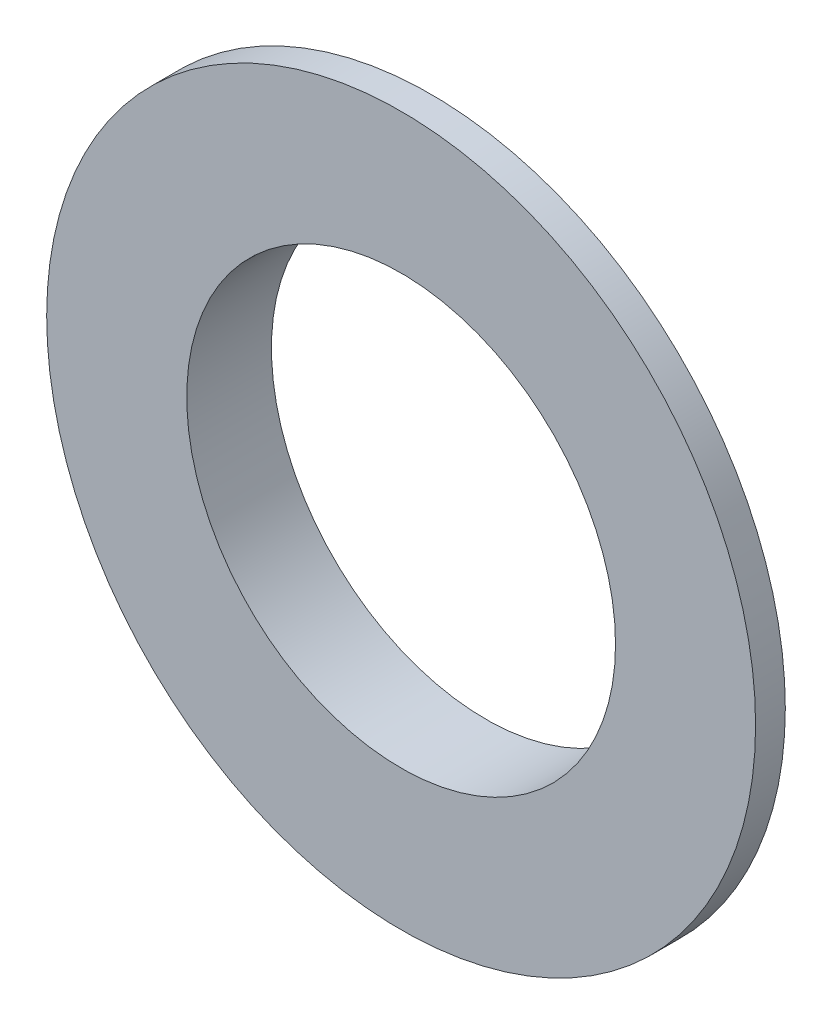
ISO-10303-21;
HEADER;
FILE_DESCRIPTION(('STEP AP214'),'2;1');
FILE_NAME('part.step','',(''),(''),'','','');
FILE_SCHEMA(('AUTOMOTIVE_DESIGN { 1 0 10303 214 1 1 1 1 }'));
ENDSEC;
DATA;
#1=APPLICATION_CONTEXT('core data for automotive mechanical design processes');
#2=APPLICATION_PROTOCOL_DEFINITION('international standard','automotive_design',2000,#1);
#3=PRODUCT_CONTEXT('',#1,'mechanical');
#4=PRODUCT('Part','Part','',(#3));
#5=PRODUCT_RELATED_PRODUCT_CATEGORY('part','',(#4));
#6=PRODUCT_DEFINITION_FORMATION('','',#4);
#7=PRODUCT_DEFINITION_CONTEXT('part definition',#1,'design');
#8=PRODUCT_DEFINITION('design','',#6,#7);
#9=PRODUCT_DEFINITION_SHAPE('','',#8);
#10=(LENGTH_UNIT() NAMED_UNIT(*) SI_UNIT(.MILLI.,.METRE.));
#11=(NAMED_UNIT(*) PLANE_ANGLE_UNIT() SI_UNIT($,.RADIAN.));
#12=(NAMED_UNIT(*) SI_UNIT($,.STERADIAN.) SOLID_ANGLE_UNIT());
#13=UNCERTAINTY_MEASURE_WITH_UNIT(LENGTH_MEASURE(1.E-05),#10,'distance_accuracy_value','');
#14=(GEOMETRIC_REPRESENTATION_CONTEXT(3) GLOBAL_UNCERTAINTY_ASSIGNED_CONTEXT((#13)) GLOBAL_UNIT_ASSIGNED_CONTEXT((#10,
#11,#12)) REPRESENTATION_CONTEXT('',''));
#15=CARTESIAN_POINT('',(0.,0.,0.));
#16=DIRECTION('',(0.,0.,1.));
#17=DIRECTION('',(1.,0.,0.));
#18=AXIS2_PLACEMENT_3D('',#15,#16,#17);
#19=CARTESIAN_POINT('',(0.,0.,0.));
#20=DIRECTION('',(0.,0.,1.));
#21=DIRECTION('',(1.,0.,0.));
#22=AXIS2_PLACEMENT_3D('',#19,#20,#21);
#23=PLANE('',#22);
#24=CARTESIAN_POINT('',(0.,0.,0.));
#25=DIRECTION('',(0.,0.,1.));
#26=DIRECTION('',(1.,0.,0.));
#27=AXIS2_PLACEMENT_3D('',#24,#25,#26);
#28=CIRCLE('',#27,7.5375);
#29=CARTESIAN_POINT('',(7.5375,0.,0.));
#30=VERTEX_POINT('',#29);
#31=EDGE_CURVE('E45',#30,#30,#28,.T.);
#32=ORIENTED_EDGE('',*,*,#31,.F.);
#33=EDGE_LOOP('',(#32));
#34=FACE_BOUND('',#33,.T.);
#35=CARTESIAN_POINT('',(0.,0.,0.));
#36=DIRECTION('',(0.,0.,1.));
#37=DIRECTION('',(1.,0.,0.));
#38=AXIS2_PLACEMENT_3D('',#35,#36,#37);
#39=CIRCLE('',#38,5.95);
#40=CARTESIAN_POINT('',(5.95,0.,0.));
#41=VERTEX_POINT('',#40);
#42=EDGE_CURVE('E54',#41,#41,#39,.T.);
#43=ORIENTED_EDGE('',*,*,#42,.T.);
#44=EDGE_LOOP('',(#43));
#45=FACE_BOUND('',#44,.T.);
#46=ADVANCED_FACE('F41',(#34,#45),#23,.F.);
#47=CARTESIAN_POINT('',(0.,0.,1.525));
#48=DIRECTION('',(0.,0.,-1.));
#49=DIRECTION('',(-1.,0.,0.));
#50=AXIS2_PLACEMENT_3D('',#47,#48,#49);
#51=CYLINDRICAL_SURFACE('',#50,7.5375);
#52=CARTESIAN_POINT('',(0.,0.,1.525));
#53=DIRECTION('',(0.,0.,1.));
#54=DIRECTION('',(1.,0.,0.));
#55=AXIS2_PLACEMENT_3D('',#52,#53,#54);
#56=CIRCLE('',#55,7.5375);
#57=CARTESIAN_POINT('',(7.5375,0.,1.525));
#58=VERTEX_POINT('',#57);
#59=EDGE_CURVE('E10',#58,#58,#56,.T.);
#60=ORIENTED_EDGE('',*,*,#59,.F.);
#61=EDGE_LOOP('',(#60));
#62=FACE_BOUND('',#61,.T.);
#63=ORIENTED_EDGE('',*,*,#31,.T.);
#64=EDGE_LOOP('',(#63));
#65=FACE_BOUND('',#64,.T.);
#66=ADVANCED_FACE('F43',(#62,#65),#51,.T.);
#67=CARTESIAN_POINT('',(0.,0.,1.525));
#68=DIRECTION('',(0.,0.,-1.));
#69=DIRECTION('',(-1.,0.,0.));
#70=AXIS2_PLACEMENT_3D('',#67,#68,#69);
#71=CYLINDRICAL_SURFACE('',#70,5.95);
#72=ORIENTED_EDGE('',*,*,#42,.F.);
#73=EDGE_LOOP('',(#72));
#74=FACE_BOUND('',#73,.T.);
#75=CARTESIAN_POINT('',(0.,0.,2.35));
#76=DIRECTION('',(0.,0.,1.));
#77=DIRECTION('',(1.,0.,0.));
#78=AXIS2_PLACEMENT_3D('',#75,#76,#77);
#79=CIRCLE('',#78,5.95);
#80=CARTESIAN_POINT('',(5.95,0.,2.35));
#81=VERTEX_POINT('',#80);
#82=EDGE_CURVE('E64',#81,#81,#79,.T.);
#83=ORIENTED_EDGE('',*,*,#82,.T.);
#84=EDGE_LOOP('',(#83));
#85=FACE_BOUND('',#84,.T.);
#86=ADVANCED_FACE('F72',(#74,#85),#71,.F.);
#87=CARTESIAN_POINT('',(0.,0.,2.35));
#88=DIRECTION('',(0.,0.,1.));
#89=DIRECTION('',(1.,0.,0.));
#90=AXIS2_PLACEMENT_3D('',#87,#88,#89);
#91=PLANE('',#90);
#92=CARTESIAN_POINT('',(0.,0.,2.35));
#93=DIRECTION('',(0.,0.,1.));
#94=DIRECTION('',(1.,0.,0.));
#95=AXIS2_PLACEMENT_3D('',#92,#93,#94);
#96=CIRCLE('',#95,9.8375);
#97=CARTESIAN_POINT('',(9.8375,0.,2.35));
#98=VERTEX_POINT('',#97);
#99=EDGE_CURVE('E59',#98,#98,#96,.T.);
#100=ORIENTED_EDGE('',*,*,#99,.T.);
#101=EDGE_LOOP('',(#100));
#102=FACE_BOUND('',#101,.T.);
#103=ORIENTED_EDGE('',*,*,#82,.F.);
#104=EDGE_LOOP('',(#103));
#105=FACE_BOUND('',#104,.T.);
#106=ADVANCED_FACE('F74',(#102,#105),#91,.T.);
#107=CARTESIAN_POINT('',(0.,0.,1.525));
#108=DIRECTION('',(0.,0.,1.));
#109=DIRECTION('',(1.,0.,0.));
#110=AXIS2_PLACEMENT_3D('',#107,#108,#109);
#111=PLANE('',#110);
#112=ORIENTED_EDGE('',*,*,#59,.T.);
#113=EDGE_LOOP('',(#112));
#114=FACE_BOUND('',#113,.T.);
#115=CARTESIAN_POINT('',(0.,0.,1.525));
#116=DIRECTION('',(0.,0.,1.));
#117=DIRECTION('',(1.,0.,0.));
#118=AXIS2_PLACEMENT_3D('',#115,#116,#117);
#119=CIRCLE('',#118,9.8375);
#120=CARTESIAN_POINT('',(9.8375,0.,1.525));
#121=VERTEX_POINT('',#120);
#122=EDGE_CURVE('E60',#121,#121,#119,.T.);
#123=ORIENTED_EDGE('',*,*,#122,.F.);
#124=EDGE_LOOP('',(#123));
#125=FACE_BOUND('',#124,.T.);
#126=ADVANCED_FACE('F76',(#114,#125),#111,.F.);
#127=CARTESIAN_POINT('',(0.,0.,2.35));
#128=DIRECTION('',(0.,0.,-1.));
#129=DIRECTION('',(-1.,0.,0.));
#130=AXIS2_PLACEMENT_3D('',#127,#128,#129);
#131=CYLINDRICAL_SURFACE('',#130,9.8375);
#132=ORIENTED_EDGE('',*,*,#99,.F.);
#133=EDGE_LOOP('',(#132));
#134=FACE_BOUND('',#133,.T.);
#135=ORIENTED_EDGE('',*,*,#122,.T.);
#136=EDGE_LOOP('',(#135));
#137=FACE_BOUND('',#136,.T.);
#138=ADVANCED_FACE('F83',(#134,#137),#131,.T.);
#139=CLOSED_SHELL('',(#46,#66,#86,#106,#126,#138));
#140=MANIFOLD_SOLID_BREP('B2',#139);
#141=ADVANCED_BREP_SHAPE_REPRESENTATION('',(#18,#140),#14);
#142=SHAPE_DEFINITION_REPRESENTATION(#9,#141);
ENDSEC;
END-ISO-10303-21;
